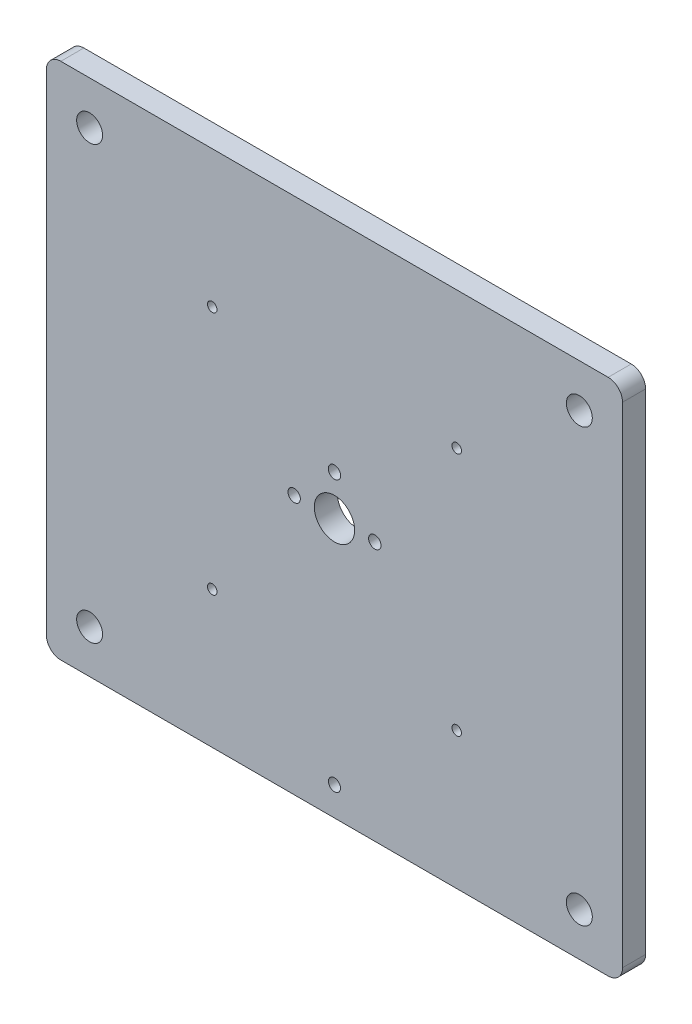
ISO-10303-21;
HEADER;
FILE_DESCRIPTION(('STEP AP214'),'2;1');
FILE_NAME('part.step','',(''),(''),'','','');
FILE_SCHEMA(('AUTOMOTIVE_DESIGN { 1 0 10303 214 1 1 1 1 }'));
ENDSEC;
DATA;
#1=APPLICATION_CONTEXT('core data for automotive mechanical design processes');
#2=APPLICATION_PROTOCOL_DEFINITION('international standard','automotive_design',2000,#1);
#3=PRODUCT_CONTEXT('',#1,'mechanical');
#4=PRODUCT('Part','Part','',(#3));
#5=PRODUCT_RELATED_PRODUCT_CATEGORY('part','',(#4));
#6=PRODUCT_DEFINITION_FORMATION('','',#4);
#7=PRODUCT_DEFINITION_CONTEXT('part definition',#1,'design');
#8=PRODUCT_DEFINITION('design','',#6,#7);
#9=PRODUCT_DEFINITION_SHAPE('','',#8);
#10=(LENGTH_UNIT() NAMED_UNIT(*) SI_UNIT(.MILLI.,.METRE.));
#11=(NAMED_UNIT(*) PLANE_ANGLE_UNIT() SI_UNIT($,.RADIAN.));
#12=(NAMED_UNIT(*) SI_UNIT($,.STERADIAN.) SOLID_ANGLE_UNIT());
#13=UNCERTAINTY_MEASURE_WITH_UNIT(LENGTH_MEASURE(1.E-05),#10,'distance_accuracy_value','');
#14=(GEOMETRIC_REPRESENTATION_CONTEXT(3) GLOBAL_UNCERTAINTY_ASSIGNED_CONTEXT((#13)) GLOBAL_UNIT_ASSIGNED_CONTEXT((#10,
#11,#12)) REPRESENTATION_CONTEXT('',''));
#15=CARTESIAN_POINT('',(0.,0.,0.));
#16=DIRECTION('',(0.,0.,1.));
#17=DIRECTION('',(1.,0.,0.));
#18=AXIS2_PLACEMENT_3D('',#15,#16,#17);
#19=CARTESIAN_POINT('',(14.,0.,0.));
#20=DIRECTION('',(0.,0.,-1.));
#21=DIRECTION('',(-1.,0.,0.));
#22=AXIS2_PLACEMENT_3D('',#19,#20,#21);
#23=CYLINDRICAL_SURFACE('',#22,3.75);
#24=CARTESIAN_POINT('',(14.,0.,0.));
#25=DIRECTION('',(0.,0.,-1.));
#26=DIRECTION('',(-1.,0.,0.));
#27=AXIS2_PLACEMENT_3D('',#24,#25,#26);
#28=CIRCLE('',#27,3.75);
#29=CARTESIAN_POINT('',(10.25,0.,0.));
#30=VERTEX_POINT('',#29);
#31=EDGE_CURVE('E217',#30,#30,#28,.F.);
#32=ORIENTED_EDGE('',*,*,#31,.F.);
#33=EDGE_LOOP('',(#32));
#34=FACE_BOUND('',#33,.T.);
#35=CARTESIAN_POINT('',(14.,0.,4.));
#36=DIRECTION('',(0.,0.,-1.));
#37=DIRECTION('',(-1.,0.,0.));
#38=AXIS2_PLACEMENT_3D('',#35,#36,#37);
#39=CIRCLE('',#38,3.75);
#40=CARTESIAN_POINT('',(10.25,0.,4.));
#41=VERTEX_POINT('',#40);
#42=EDGE_CURVE('E19',#41,#41,#39,.F.);
#43=ORIENTED_EDGE('',*,*,#42,.T.);
#44=EDGE_LOOP('',(#43));
#45=FACE_BOUND('',#44,.T.);
#46=ADVANCED_FACE('F16',(#34,#45),#23,.F.);
#47=CARTESIAN_POINT('',(-14.,0.,0.));
#48=DIRECTION('',(0.,0.,-1.));
#49=DIRECTION('',(-1.,0.,0.));
#50=AXIS2_PLACEMENT_3D('',#47,#48,#49);
#51=CYLINDRICAL_SURFACE('',#50,3.75);
#52=CARTESIAN_POINT('',(-14.,0.,0.));
#53=DIRECTION('',(0.,0.,-1.));
#54=DIRECTION('',(-1.,0.,0.));
#55=AXIS2_PLACEMENT_3D('',#52,#53,#54);
#56=CIRCLE('',#55,3.75);
#57=CARTESIAN_POINT('',(-17.75,0.,0.));
#58=VERTEX_POINT('',#57);
#59=EDGE_CURVE('E214',#58,#58,#56,.F.);
#60=ORIENTED_EDGE('',*,*,#59,.F.);
#61=EDGE_LOOP('',(#60));
#62=FACE_BOUND('',#61,.T.);
#63=CARTESIAN_POINT('',(-14.,0.,4.));
#64=DIRECTION('',(0.,0.,-1.));
#65=DIRECTION('',(-1.,0.,0.));
#66=AXIS2_PLACEMENT_3D('',#63,#64,#65);
#67=CIRCLE('',#66,3.75);
#68=CARTESIAN_POINT('',(-17.75,0.,4.));
#69=VERTEX_POINT('',#68);
#70=EDGE_CURVE('E222',#69,#69,#67,.F.);
#71=ORIENTED_EDGE('',*,*,#70,.T.);
#72=EDGE_LOOP('',(#71));
#73=FACE_BOUND('',#72,.T.);
#74=ADVANCED_FACE('F336',(#62,#73),#51,.F.);
#75=CARTESIAN_POINT('',(0.,14.,0.));
#76=DIRECTION('',(0.,0.,-1.));
#77=DIRECTION('',(-1.,0.,0.));
#78=AXIS2_PLACEMENT_3D('',#75,#76,#77);
#79=CYLINDRICAL_SURFACE('',#78,3.75);
#80=CARTESIAN_POINT('',(0.,14.,0.));
#81=DIRECTION('',(0.,0.,-1.));
#82=DIRECTION('',(-1.,0.,0.));
#83=AXIS2_PLACEMENT_3D('',#80,#81,#82);
#84=CIRCLE('',#83,3.75);
#85=CARTESIAN_POINT('',(-3.75,14.,0.));
#86=VERTEX_POINT('',#85);
#87=EDGE_CURVE('E211',#86,#86,#84,.F.);
#88=ORIENTED_EDGE('',*,*,#87,.F.);
#89=EDGE_LOOP('',(#88));
#90=FACE_BOUND('',#89,.T.);
#91=CARTESIAN_POINT('',(0.,14.,4.));
#92=DIRECTION('',(0.,0.,-1.));
#93=DIRECTION('',(-1.,0.,0.));
#94=AXIS2_PLACEMENT_3D('',#91,#92,#93);
#95=CIRCLE('',#94,3.75);
#96=CARTESIAN_POINT('',(-3.75,14.,4.));
#97=VERTEX_POINT('',#96);
#98=EDGE_CURVE('E220',#97,#97,#95,.F.);
#99=ORIENTED_EDGE('',*,*,#98,.T.);
#100=EDGE_LOOP('',(#99));
#101=FACE_BOUND('',#100,.T.);
#102=ADVANCED_FACE('F234',(#90,#101),#79,.F.);
#103=CARTESIAN_POINT('',(16.15,0.,4.));
#104=DIRECTION('',(0.,0.,1.));
#105=DIRECTION('',(1.,0.,0.));
#106=AXIS2_PLACEMENT_3D('',#103,#104,#105);
#107=PLANE('',#106);
#108=ORIENTED_EDGE('',*,*,#42,.F.);
#109=EDGE_LOOP('',(#108));
#110=FACE_BOUND('',#109,.T.);
#111=CARTESIAN_POINT('',(14.,0.,4.));
#112=DIRECTION('',(0.,0.,-1.));
#113=DIRECTION('',(-1.,0.,0.));
#114=AXIS2_PLACEMENT_3D('',#111,#112,#113);
#115=CIRCLE('',#114,2.15);
#116=CARTESIAN_POINT('',(11.85,0.,4.));
#117=VERTEX_POINT('',#116);
#118=EDGE_CURVE('E193',#117,#117,#115,.F.);
#119=ORIENTED_EDGE('',*,*,#118,.T.);
#120=EDGE_LOOP('',(#119));
#121=FACE_BOUND('',#120,.T.);
#122=ADVANCED_FACE('F230',(#110,#121),#107,.F.);
#123=CARTESIAN_POINT('',(-11.85,0.,4.));
#124=DIRECTION('',(0.,0.,1.));
#125=DIRECTION('',(1.,0.,0.));
#126=AXIS2_PLACEMENT_3D('',#123,#124,#125);
#127=PLANE('',#126);
#128=ORIENTED_EDGE('',*,*,#70,.F.);
#129=EDGE_LOOP('',(#128));
#130=FACE_BOUND('',#129,.T.);
#131=CARTESIAN_POINT('',(-14.,0.,4.));
#132=DIRECTION('',(0.,0.,-1.));
#133=DIRECTION('',(-1.,0.,0.));
#134=AXIS2_PLACEMENT_3D('',#131,#132,#133);
#135=CIRCLE('',#134,2.15);
#136=CARTESIAN_POINT('',(-16.15,0.,4.));
#137=VERTEX_POINT('',#136);
#138=EDGE_CURVE('E190',#137,#137,#135,.F.);
#139=ORIENTED_EDGE('',*,*,#138,.T.);
#140=EDGE_LOOP('',(#139));
#141=FACE_BOUND('',#140,.T.);
#142=ADVANCED_FACE('F233',(#130,#141),#127,.F.);
#143=CARTESIAN_POINT('',(2.15,14.,4.));
#144=DIRECTION('',(0.,0.,1.));
#145=DIRECTION('',(1.,0.,0.));
#146=AXIS2_PLACEMENT_3D('',#143,#144,#145);
#147=PLANE('',#146);
#148=ORIENTED_EDGE('',*,*,#98,.F.);
#149=EDGE_LOOP('',(#148));
#150=FACE_BOUND('',#149,.T.);
#151=CARTESIAN_POINT('',(0.,14.,4.));
#152=DIRECTION('',(0.,0.,-1.));
#153=DIRECTION('',(-1.,0.,0.));
#154=AXIS2_PLACEMENT_3D('',#151,#152,#153);
#155=CIRCLE('',#154,2.15);
#156=CARTESIAN_POINT('',(-2.15,14.,4.));
#157=VERTEX_POINT('',#156);
#158=EDGE_CURVE('E99',#157,#157,#155,.F.);
#159=ORIENTED_EDGE('',*,*,#158,.T.);
#160=EDGE_LOOP('',(#159));
#161=FACE_BOUND('',#160,.T.);
#162=ADVANCED_FACE('F319',(#150,#161),#147,.F.);
#163=CARTESIAN_POINT('',(-95.,85.,0.));
#164=DIRECTION('',(0.,0.,-1.));
#165=DIRECTION('',(-1.,0.,0.));
#166=AXIS2_PLACEMENT_3D('',#163,#164,#165);
#167=PLANE('',#166);
#168=CARTESIAN_POINT('',(0.,0.,0.));
#169=DIRECTION('',(0.,0.,-1.));
#170=DIRECTION('',(-1.,0.,0.));
#171=AXIS2_PLACEMENT_3D('',#168,#169,#170);
#172=CIRCLE('',#171,7.);
#173=CARTESIAN_POINT('',(-7.,0.,0.));
#174=VERTEX_POINT('',#173);
#175=EDGE_CURVE('E167',#174,#174,#172,.F.);
#176=ORIENTED_EDGE('',*,*,#175,.T.);
#177=EDGE_LOOP('',(#176));
#178=FACE_BOUND('',#177,.T.);
#179=CARTESIAN_POINT('',(85.,-75.,0.));
#180=DIRECTION('',(0.,0.,-1.));
#181=DIRECTION('',(-1.,0.,0.));
#182=AXIS2_PLACEMENT_3D('',#179,#180,#181);
#183=CIRCLE('',#182,4.49999999999999);
#184=CARTESIAN_POINT('',(80.5,-75.,0.));
#185=VERTEX_POINT('',#184);
#186=EDGE_CURVE('E173',#185,#185,#183,.F.);
#187=ORIENTED_EDGE('',*,*,#186,.T.);
#188=EDGE_LOOP('',(#187));
#189=FACE_BOUND('',#188,.T.);
#190=CARTESIAN_POINT('',(-85.,75.,0.));
#191=DIRECTION('',(0.,0.,-1.));
#192=DIRECTION('',(-1.,0.,0.));
#193=AXIS2_PLACEMENT_3D('',#190,#191,#192);
#194=CIRCLE('',#193,4.49999999999999);
#195=CARTESIAN_POINT('',(-89.5,75.,0.));
#196=VERTEX_POINT('',#195);
#197=EDGE_CURVE('E179',#196,#196,#194,.F.);
#198=ORIENTED_EDGE('',*,*,#197,.T.);
#199=EDGE_LOOP('',(#198));
#200=FACE_BOUND('',#199,.T.);
#201=CARTESIAN_POINT('',(-95.,-85.,0.));
#202=DIRECTION('',(0.,0.,-1.));
#203=DIRECTION('',(-1.,0.,0.));
#204=AXIS2_PLACEMENT_3D('',#201,#202,#203);
#205=CIRCLE('',#204,5.00000000000002);
#206=CARTESIAN_POINT('',(-100.,-85.,0.));
#207=VERTEX_POINT('',#206);
#208=CARTESIAN_POINT('',(-95.,-90.,0.));
#209=VERTEX_POINT('',#208);
#210=EDGE_CURVE('E115',#207,#209,#205,.F.);
#211=ORIENTED_EDGE('',*,*,#210,.F.);
#212=DIRECTION('',(0.,1.,0.));
#213=VECTOR('',#212,1.);
#214=CARTESIAN_POINT('',(-100.,85.,0.));
#215=LINE('',#214,#213);
#216=CARTESIAN_POINT('',(-100.,85.,0.));
#217=VERTEX_POINT('',#216);
#218=EDGE_CURVE('E109',#207,#217,#215,.T.);
#219=ORIENTED_EDGE('',*,*,#218,.T.);
#220=CARTESIAN_POINT('',(-95.,85.,0.));
#221=DIRECTION('',(0.,0.,-1.));
#222=DIRECTION('',(-1.,0.,0.));
#223=AXIS2_PLACEMENT_3D('',#220,#221,#222);
#224=CIRCLE('',#223,5.);
#225=CARTESIAN_POINT('',(-95.,90.,0.));
#226=VERTEX_POINT('',#225);
#227=EDGE_CURVE('E95',#226,#217,#224,.F.);
#228=ORIENTED_EDGE('',*,*,#227,.F.);
#229=DIRECTION('',(1.,0.,0.));
#230=VECTOR('',#229,1.);
#231=CARTESIAN_POINT('',(-95.,90.,0.));
#232=LINE('',#231,#230);
#233=CARTESIAN_POINT('',(95.,90.,0.));
#234=VERTEX_POINT('',#233);
#235=EDGE_CURVE('E89',#226,#234,#232,.T.);
#236=ORIENTED_EDGE('',*,*,#235,.T.);
#237=CARTESIAN_POINT('',(95.,85.,0.));
#238=DIRECTION('',(0.,0.,-1.));
#239=DIRECTION('',(-1.,0.,0.));
#240=AXIS2_PLACEMENT_3D('',#237,#238,#239);
#241=CIRCLE('',#240,5.);
#242=CARTESIAN_POINT('',(100.,85.,0.));
#243=VERTEX_POINT('',#242);
#244=EDGE_CURVE('E79',#243,#234,#241,.F.);
#245=ORIENTED_EDGE('',*,*,#244,.F.);
#246=DIRECTION('',(0.,-1.,0.));
#247=VECTOR('',#246,1.);
#248=CARTESIAN_POINT('',(100.,85.,0.));
#249=LINE('',#248,#247);
#250=CARTESIAN_POINT('',(100.,-85.,0.));
#251=VERTEX_POINT('',#250);
#252=EDGE_CURVE('E105',#243,#251,#249,.T.);
#253=ORIENTED_EDGE('',*,*,#252,.T.);
#254=CARTESIAN_POINT('',(95.,-85.,0.));
#255=DIRECTION('',(0.,0.,-1.));
#256=DIRECTION('',(-1.,0.,0.));
#257=AXIS2_PLACEMENT_3D('',#254,#255,#256);
#258=CIRCLE('',#257,5.);
#259=CARTESIAN_POINT('',(95.,-90.,0.));
#260=VERTEX_POINT('',#259);
#261=EDGE_CURVE('E117',#260,#251,#258,.F.);
#262=ORIENTED_EDGE('',*,*,#261,.F.);
#263=DIRECTION('',(1.,0.,0.));
#264=VECTOR('',#263,1.);
#265=CARTESIAN_POINT('',(-95.,-90.,0.));
#266=LINE('',#265,#264);
#267=EDGE_CURVE('E112',#260,#209,#266,.F.);
#268=ORIENTED_EDGE('',*,*,#267,.T.);
#269=EDGE_LOOP('',(#211,#219,#228,#236,#245,#253,#262,#268));
#270=FACE_BOUND('',#269,.T.);
#271=CARTESIAN_POINT('',(-85.,-75.,0.));
#272=DIRECTION('',(0.,0.,-1.));
#273=DIRECTION('',(-1.,0.,0.));
#274=AXIS2_PLACEMENT_3D('',#271,#272,#273);
#275=CIRCLE('',#274,4.5);
#276=CARTESIAN_POINT('',(-89.5,-75.,0.));
#277=VERTEX_POINT('',#276);
#278=EDGE_CURVE('E176',#277,#277,#275,.F.);
#279=ORIENTED_EDGE('',*,*,#278,.T.);
#280=EDGE_LOOP('',(#279));
#281=FACE_BOUND('',#280,.T.);
#282=CARTESIAN_POINT('',(85.,75.,0.));
#283=DIRECTION('',(0.,0.,-1.));
#284=DIRECTION('',(-1.,0.,0.));
#285=AXIS2_PLACEMENT_3D('',#282,#283,#284);
#286=CIRCLE('',#285,4.5);
#287=CARTESIAN_POINT('',(80.5,75.,0.));
#288=VERTEX_POINT('',#287);
#289=EDGE_CURVE('E170',#288,#288,#286,.F.);
#290=ORIENTED_EDGE('',*,*,#289,.T.);
#291=EDGE_LOOP('',(#290));
#292=FACE_BOUND('',#291,.T.);
#293=ORIENTED_EDGE('',*,*,#87,.T.);
#294=EDGE_LOOP('',(#293));
#295=FACE_BOUND('',#294,.T.);
#296=ORIENTED_EDGE('',*,*,#59,.T.);
#297=EDGE_LOOP('',(#296));
#298=FACE_BOUND('',#297,.T.);
#299=ORIENTED_EDGE('',*,*,#31,.T.);
#300=EDGE_LOOP('',(#299));
#301=FACE_BOUND('',#300,.T.);
#302=CARTESIAN_POINT('',(0.,-80.,0.));
#303=DIRECTION('',(0.,0.,1.));
#304=DIRECTION('',(1.,0.,0.));
#305=AXIS2_PLACEMENT_3D('',#302,#303,#304);
#306=CIRCLE('',#305,2.1);
#307=CARTESIAN_POINT('',(2.1,-80.,0.));
#308=VERTEX_POINT('',#307);
#309=EDGE_CURVE('E196',#308,#308,#306,.T.);
#310=ORIENTED_EDGE('',*,*,#309,.T.);
#311=EDGE_LOOP('',(#310));
#312=FACE_BOUND('',#311,.T.);
#313=CARTESIAN_POINT('',(-42.4264068711929,42.4264068711928,0.));
#314=DIRECTION('',(0.,0.,1.));
#315=DIRECTION('',(1.,0.,0.));
#316=AXIS2_PLACEMENT_3D('',#313,#314,#315);
#317=CIRCLE('',#316,1.65);
#318=CARTESIAN_POINT('',(-40.7764068711929,42.4264068711928,0.));
#319=VERTEX_POINT('',#318);
#320=EDGE_CURVE('E199',#319,#319,#317,.T.);
#321=ORIENTED_EDGE('',*,*,#320,.T.);
#322=EDGE_LOOP('',(#321));
#323=FACE_BOUND('',#322,.T.);
#324=CARTESIAN_POINT('',(42.4264068711929,42.4264068711928,0.));
#325=DIRECTION('',(0.,0.,1.));
#326=DIRECTION('',(1.,0.,0.));
#327=AXIS2_PLACEMENT_3D('',#324,#325,#326);
#328=CIRCLE('',#327,1.65);
#329=CARTESIAN_POINT('',(44.0764068711929,42.4264068711928,0.));
#330=VERTEX_POINT('',#329);
#331=EDGE_CURVE('E202',#330,#330,#328,.T.);
#332=ORIENTED_EDGE('',*,*,#331,.T.);
#333=EDGE_LOOP('',(#332));
#334=FACE_BOUND('',#333,.T.);
#335=CARTESIAN_POINT('',(42.4264068711929,-42.4264068711928,0.));
#336=DIRECTION('',(0.,0.,1.));
#337=DIRECTION('',(1.,0.,0.));
#338=AXIS2_PLACEMENT_3D('',#335,#336,#337);
#339=CIRCLE('',#338,1.65);
#340=CARTESIAN_POINT('',(44.0764068711929,-42.4264068711928,0.));
#341=VERTEX_POINT('',#340);
#342=EDGE_CURVE('E205',#341,#341,#339,.T.);
#343=ORIENTED_EDGE('',*,*,#342,.T.);
#344=EDGE_LOOP('',(#343));
#345=FACE_BOUND('',#344,.T.);
#346=CARTESIAN_POINT('',(-42.4264068711932,-42.4264068711925,0.));
#347=DIRECTION('',(0.,0.,1.));
#348=DIRECTION('',(1.,0.,0.));
#349=AXIS2_PLACEMENT_3D('',#346,#347,#348);
#350=CIRCLE('',#349,1.65);
#351=CARTESIAN_POINT('',(-40.7764068711932,-42.4264068711925,0.));
#352=VERTEX_POINT('',#351);
#353=EDGE_CURVE('E208',#352,#352,#350,.T.);
#354=ORIENTED_EDGE('',*,*,#353,.T.);
#355=EDGE_LOOP('',(#354));
#356=FACE_BOUND('',#355,.T.);
#357=ADVANCED_FACE('F92',(#178,#189,#200,#270,#281,#292,#295,#298,#301,#312,#323,#334,#345,
#356),#167,.T.);
#358=CARTESIAN_POINT('',(-42.4264068711932,-42.4264068711925,8.));
#359=DIRECTION('',(0.,0.,1.));
#360=DIRECTION('',(1.,0.,0.));
#361=AXIS2_PLACEMENT_3D('',#358,#359,#360);
#362=CYLINDRICAL_SURFACE('',#361,1.65);
#363=ORIENTED_EDGE('',*,*,#353,.F.);
#364=EDGE_LOOP('',(#363));
#365=FACE_BOUND('',#364,.T.);
#366=CARTESIAN_POINT('',(-42.4264068711932,-42.4264068711925,8.));
#367=DIRECTION('',(0.,0.,1.));
#368=DIRECTION('',(1.,0.,0.));
#369=AXIS2_PLACEMENT_3D('',#366,#367,#368);
#370=CIRCLE('',#369,1.65);
#371=CARTESIAN_POINT('',(-40.7764068711932,-42.4264068711925,8.));
#372=VERTEX_POINT('',#371);
#373=EDGE_CURVE('E164',#372,#372,#370,.T.);
#374=ORIENTED_EDGE('',*,*,#373,.T.);
#375=EDGE_LOOP('',(#374));
#376=FACE_BOUND('',#375,.T.);
#377=ADVANCED_FACE('F327',(#365,#376),#362,.F.);
#378=CARTESIAN_POINT('',(42.4264068711929,-42.4264068711928,8.));
#379=DIRECTION('',(0.,0.,1.));
#380=DIRECTION('',(1.,0.,0.));
#381=AXIS2_PLACEMENT_3D('',#378,#379,#380);
#382=CYLINDRICAL_SURFACE('',#381,1.65);
#383=ORIENTED_EDGE('',*,*,#342,.F.);
#384=EDGE_LOOP('',(#383));
#385=FACE_BOUND('',#384,.T.);
#386=CARTESIAN_POINT('',(42.4264068711929,-42.4264068711928,8.));
#387=DIRECTION('',(0.,0.,1.));
#388=DIRECTION('',(1.,0.,0.));
#389=AXIS2_PLACEMENT_3D('',#386,#387,#388);
#390=CIRCLE('',#389,1.65);
#391=CARTESIAN_POINT('',(44.0764068711929,-42.4264068711928,8.));
#392=VERTEX_POINT('',#391);
#393=EDGE_CURVE('E161',#392,#392,#390,.T.);
#394=ORIENTED_EDGE('',*,*,#393,.T.);
#395=EDGE_LOOP('',(#394));
#396=FACE_BOUND('',#395,.T.);
#397=ADVANCED_FACE('F362',(#385,#396),#382,.F.);
#398=CARTESIAN_POINT('',(42.4264068711929,42.4264068711928,8.));
#399=DIRECTION('',(0.,0.,1.));
#400=DIRECTION('',(1.,0.,0.));
#401=AXIS2_PLACEMENT_3D('',#398,#399,#400);
#402=CYLINDRICAL_SURFACE('',#401,1.65);
#403=ORIENTED_EDGE('',*,*,#331,.F.);
#404=EDGE_LOOP('',(#403));
#405=FACE_BOUND('',#404,.T.);
#406=CARTESIAN_POINT('',(42.4264068711929,42.4264068711928,8.));
#407=DIRECTION('',(0.,0.,1.));
#408=DIRECTION('',(1.,0.,0.));
#409=AXIS2_PLACEMENT_3D('',#406,#407,#408);
#410=CIRCLE('',#409,1.65);
#411=CARTESIAN_POINT('',(44.0764068711929,42.4264068711928,8.));
#412=VERTEX_POINT('',#411);
#413=EDGE_CURVE('E158',#412,#412,#410,.T.);
#414=ORIENTED_EDGE('',*,*,#413,.T.);
#415=EDGE_LOOP('',(#414));
#416=FACE_BOUND('',#415,.T.);
#417=ADVANCED_FACE('F368',(#405,#416),#402,.F.);
#418=CARTESIAN_POINT('',(-42.4264068711929,42.4264068711928,8.));
#419=DIRECTION('',(0.,0.,1.));
#420=DIRECTION('',(1.,0.,0.));
#421=AXIS2_PLACEMENT_3D('',#418,#419,#420);
#422=CYLINDRICAL_SURFACE('',#421,1.65);
#423=ORIENTED_EDGE('',*,*,#320,.F.);
#424=EDGE_LOOP('',(#423));
#425=FACE_BOUND('',#424,.T.);
#426=CARTESIAN_POINT('',(-42.4264068711929,42.4264068711928,8.));
#427=DIRECTION('',(0.,0.,1.));
#428=DIRECTION('',(1.,0.,0.));
#429=AXIS2_PLACEMENT_3D('',#426,#427,#428);
#430=CIRCLE('',#429,1.65);
#431=CARTESIAN_POINT('',(-40.7764068711929,42.4264068711928,8.));
#432=VERTEX_POINT('',#431);
#433=EDGE_CURVE('E155',#432,#432,#430,.T.);
#434=ORIENTED_EDGE('',*,*,#433,.T.);
#435=EDGE_LOOP('',(#434));
#436=FACE_BOUND('',#435,.T.);
#437=ADVANCED_FACE('F252',(#425,#436),#422,.F.);
#438=CARTESIAN_POINT('',(0.,-80.,8.));
#439=DIRECTION('',(0.,0.,1.));
#440=DIRECTION('',(1.,0.,0.));
#441=AXIS2_PLACEMENT_3D('',#438,#439,#440);
#442=CYLINDRICAL_SURFACE('',#441,2.1);
#443=ORIENTED_EDGE('',*,*,#309,.F.);
#444=EDGE_LOOP('',(#443));
#445=FACE_BOUND('',#444,.T.);
#446=CARTESIAN_POINT('',(0.,-80.,8.));
#447=DIRECTION('',(0.,0.,1.));
#448=DIRECTION('',(1.,0.,0.));
#449=AXIS2_PLACEMENT_3D('',#446,#447,#448);
#450=CIRCLE('',#449,2.1);
#451=CARTESIAN_POINT('',(2.1,-80.,8.));
#452=VERTEX_POINT('',#451);
#453=EDGE_CURVE('E152',#452,#452,#450,.T.);
#454=ORIENTED_EDGE('',*,*,#453,.T.);
#455=EDGE_LOOP('',(#454));
#456=FACE_BOUND('',#455,.T.);
#457=ADVANCED_FACE('F241',(#445,#456),#442,.F.);
#458=CARTESIAN_POINT('',(14.,0.,0.));
#459=DIRECTION('',(0.,0.,-1.));
#460=DIRECTION('',(-1.,0.,0.));
#461=AXIS2_PLACEMENT_3D('',#458,#459,#460);
#462=CYLINDRICAL_SURFACE('',#461,2.15);
#463=CARTESIAN_POINT('',(14.,0.,8.));
#464=DIRECTION('',(0.,0.,-1.));
#465=DIRECTION('',(-1.,0.,0.));
#466=AXIS2_PLACEMENT_3D('',#463,#464,#465);
#467=CIRCLE('',#466,2.15);
#468=CARTESIAN_POINT('',(11.85,0.,8.));
#469=VERTEX_POINT('',#468);
#470=EDGE_CURVE('E149',#469,#469,#467,.F.);
#471=ORIENTED_EDGE('',*,*,#470,.T.);
#472=EDGE_LOOP('',(#471));
#473=FACE_BOUND('',#472,.T.);
#474=ORIENTED_EDGE('',*,*,#118,.F.);
#475=EDGE_LOOP('',(#474));
#476=FACE_BOUND('',#475,.T.);
#477=ADVANCED_FACE('F238',(#473,#476),#462,.F.);
#478=CARTESIAN_POINT('',(-14.,0.,0.));
#479=DIRECTION('',(0.,0.,-1.));
#480=DIRECTION('',(-1.,0.,0.));
#481=AXIS2_PLACEMENT_3D('',#478,#479,#480);
#482=CYLINDRICAL_SURFACE('',#481,2.15);
#483=CARTESIAN_POINT('',(-14.,0.,8.));
#484=DIRECTION('',(0.,0.,-1.));
#485=DIRECTION('',(-1.,0.,0.));
#486=AXIS2_PLACEMENT_3D('',#483,#484,#485);
#487=CIRCLE('',#486,2.15);
#488=CARTESIAN_POINT('',(-16.15,0.,8.));
#489=VERTEX_POINT('',#488);
#490=EDGE_CURVE('E146',#489,#489,#487,.F.);
#491=ORIENTED_EDGE('',*,*,#490,.T.);
#492=EDGE_LOOP('',(#491));
#493=FACE_BOUND('',#492,.T.);
#494=ORIENTED_EDGE('',*,*,#138,.F.);
#495=EDGE_LOOP('',(#494));
#496=FACE_BOUND('',#495,.T.);
#497=ADVANCED_FACE('F240',(#493,#496),#482,.F.);
#498=CARTESIAN_POINT('',(0.,14.,0.));
#499=DIRECTION('',(0.,0.,-1.));
#500=DIRECTION('',(-1.,0.,0.));
#501=AXIS2_PLACEMENT_3D('',#498,#499,#500);
#502=CYLINDRICAL_SURFACE('',#501,2.15);
#503=CARTESIAN_POINT('',(0.,14.,8.));
#504=DIRECTION('',(0.,0.,-1.));
#505=DIRECTION('',(-1.,0.,0.));
#506=AXIS2_PLACEMENT_3D('',#503,#504,#505);
#507=CIRCLE('',#506,2.15);
#508=CARTESIAN_POINT('',(-2.15,14.,8.));
#509=VERTEX_POINT('',#508);
#510=EDGE_CURVE('E143',#509,#509,#507,.F.);
#511=ORIENTED_EDGE('',*,*,#510,.T.);
#512=EDGE_LOOP('',(#511));
#513=FACE_BOUND('',#512,.T.);
#514=ORIENTED_EDGE('',*,*,#158,.F.);
#515=EDGE_LOOP('',(#514));
#516=FACE_BOUND('',#515,.T.);
#517=ADVANCED_FACE('F249',(#513,#516),#502,.F.);
#518=CARTESIAN_POINT('',(-95.,90.,8.));
#519=DIRECTION('',(0.,-1.,0.));
#520=DIRECTION('',(0.,0.,-1.));
#521=AXIS2_PLACEMENT_3D('',#518,#519,#520);
#522=PLANE('',#521);
#523=DIRECTION('',(0.,0.,-1.));
#524=VECTOR('',#523,1.);
#525=CARTESIAN_POINT('',(-95.,90.,8.));
#526=LINE('',#525,#524);
#527=CARTESIAN_POINT('',(-95.,90.,8.));
#528=VERTEX_POINT('',#527);
#529=EDGE_CURVE('E182',#528,#226,#526,.T.);
#530=ORIENTED_EDGE('',*,*,#529,.F.);
#531=DIRECTION('',(-1.,0.,0.));
#532=VECTOR('',#531,1.);
#533=CARTESIAN_POINT('',(-95.,90.,8.));
#534=LINE('',#533,#532);
#535=CARTESIAN_POINT('',(95.,90.,8.));
#536=VERTEX_POINT('',#535);
#537=EDGE_CURVE('E103',#528,#536,#534,.F.);
#538=ORIENTED_EDGE('',*,*,#537,.T.);
#539=DIRECTION('',(0.,0.,-1.));
#540=VECTOR('',#539,1.);
#541=CARTESIAN_POINT('',(95.,90.,8.));
#542=LINE('',#541,#540);
#543=EDGE_CURVE('E86',#234,#536,#542,.F.);
#544=ORIENTED_EDGE('',*,*,#543,.F.);
#545=ORIENTED_EDGE('',*,*,#235,.F.);
#546=EDGE_LOOP('',(#530,#538,#544,#545));
#547=FACE_BOUND('',#546,.T.);
#548=ADVANCED_FACE('F102',(#547),#522,.F.);
#549=CARTESIAN_POINT('',(95.,85.,8.));
#550=DIRECTION('',(0.,0.,-1.));
#551=DIRECTION('',(-1.,0.,0.));
#552=AXIS2_PLACEMENT_3D('',#549,#550,#551);
#553=CYLINDRICAL_SURFACE('',#552,5.);
#554=CARTESIAN_POINT('',(95.,85.,8.));
#555=DIRECTION('',(0.,0.,-1.));
#556=DIRECTION('',(-1.,0.,0.));
#557=AXIS2_PLACEMENT_3D('',#554,#555,#556);
#558=CIRCLE('',#557,5.);
#559=CARTESIAN_POINT('',(100.,85.,8.));
#560=VERTEX_POINT('',#559);
#561=EDGE_CURVE('E141',#536,#560,#558,.T.);
#562=ORIENTED_EDGE('',*,*,#561,.T.);
#563=DIRECTION('',(0.,0.,1.));
#564=VECTOR('',#563,1.);
#565=CARTESIAN_POINT('',(100.,85.,8.));
#566=LINE('',#565,#564);
#567=EDGE_CURVE('E88',#560,#243,#566,.F.);
#568=ORIENTED_EDGE('',*,*,#567,.T.);
#569=ORIENTED_EDGE('',*,*,#244,.T.);
#570=ORIENTED_EDGE('',*,*,#543,.T.);
#571=EDGE_LOOP('',(#562,#568,#569,#570));
#572=FACE_BOUND('',#571,.T.);
#573=ADVANCED_FACE('F84',(#572),#553,.T.);
#574=CARTESIAN_POINT('',(100.,85.,8.));
#575=DIRECTION('',(-1.,0.,0.));
#576=DIRECTION('',(0.,-1.,0.));
#577=AXIS2_PLACEMENT_3D('',#574,#575,#576);
#578=PLANE('',#577);
#579=ORIENTED_EDGE('',*,*,#567,.F.);
#580=DIRECTION('',(0.,1.,0.));
#581=VECTOR('',#580,1.);
#582=CARTESIAN_POINT('',(100.,85.,8.));
#583=LINE('',#582,#581);
#584=CARTESIAN_POINT('',(100.,-85.,8.));
#585=VERTEX_POINT('',#584);
#586=EDGE_CURVE('E140',#560,#585,#583,.F.);
#587=ORIENTED_EDGE('',*,*,#586,.T.);
#588=DIRECTION('',(0.,0.,-1.));
#589=VECTOR('',#588,1.);
#590=CARTESIAN_POINT('',(100.,-85.,8.));
#591=LINE('',#590,#589);
#592=EDGE_CURVE('E186',#251,#585,#591,.F.);
#593=ORIENTED_EDGE('',*,*,#592,.F.);
#594=ORIENTED_EDGE('',*,*,#252,.F.);
#595=EDGE_LOOP('',(#579,#587,#593,#594));
#596=FACE_BOUND('',#595,.T.);
#597=ADVANCED_FACE('F302',(#596),#578,.F.);
#598=CARTESIAN_POINT('',(95.,-85.,8.));
#599=DIRECTION('',(0.,0.,-1.));
#600=DIRECTION('',(-1.,0.,0.));
#601=AXIS2_PLACEMENT_3D('',#598,#599,#600);
#602=CYLINDRICAL_SURFACE('',#601,5.);
#603=CARTESIAN_POINT('',(95.,-85.,8.));
#604=DIRECTION('',(0.,0.,-1.));
#605=DIRECTION('',(-1.,0.,0.));
#606=AXIS2_PLACEMENT_3D('',#603,#604,#605);
#607=CIRCLE('',#606,5.);
#608=CARTESIAN_POINT('',(95.,-90.,8.));
#609=VERTEX_POINT('',#608);
#610=EDGE_CURVE('E137',#585,#609,#607,.T.);
#611=ORIENTED_EDGE('',*,*,#610,.T.);
#612=DIRECTION('',(0.,0.,1.));
#613=VECTOR('',#612,1.);
#614=CARTESIAN_POINT('',(95.,-90.,8.));
#615=LINE('',#614,#613);
#616=EDGE_CURVE('E116',#609,#260,#615,.F.);
#617=ORIENTED_EDGE('',*,*,#616,.T.);
#618=ORIENTED_EDGE('',*,*,#261,.T.);
#619=ORIENTED_EDGE('',*,*,#592,.T.);
#620=EDGE_LOOP('',(#611,#617,#618,#619));
#621=FACE_BOUND('',#620,.T.);
#622=ADVANCED_FACE('F298',(#621),#602,.T.);
#623=CARTESIAN_POINT('',(-95.,-90.,8.));
#624=DIRECTION('',(0.,1.,0.));
#625=DIRECTION('',(0.,0.,1.));
#626=AXIS2_PLACEMENT_3D('',#623,#624,#625);
#627=PLANE('',#626);
#628=ORIENTED_EDGE('',*,*,#616,.F.);
#629=DIRECTION('',(-1.,0.,0.));
#630=VECTOR('',#629,1.);
#631=CARTESIAN_POINT('',(-95.,-90.,8.));
#632=LINE('',#631,#630);
#633=CARTESIAN_POINT('',(-95.,-90.,8.));
#634=VERTEX_POINT('',#633);
#635=EDGE_CURVE('E136',#609,#634,#632,.T.);
#636=ORIENTED_EDGE('',*,*,#635,.T.);
#637=DIRECTION('',(0.,0.,-1.));
#638=VECTOR('',#637,1.);
#639=CARTESIAN_POINT('',(-95.,-90.,8.));
#640=LINE('',#639,#638);
#641=EDGE_CURVE('E185',#209,#634,#640,.F.);
#642=ORIENTED_EDGE('',*,*,#641,.F.);
#643=ORIENTED_EDGE('',*,*,#267,.F.);
#644=EDGE_LOOP('',(#628,#636,#642,#643));
#645=FACE_BOUND('',#644,.T.);
#646=ADVANCED_FACE('F294',(#645),#627,.F.);
#647=CARTESIAN_POINT('',(-95.,-85.,8.));
#648=DIRECTION('',(0.,0.,-1.));
#649=DIRECTION('',(-1.,0.,0.));
#650=AXIS2_PLACEMENT_3D('',#647,#648,#649);
#651=CYLINDRICAL_SURFACE('',#650,5.00000000000002);
#652=CARTESIAN_POINT('',(-95.,-85.,8.));
#653=DIRECTION('',(0.,0.,-1.));
#654=DIRECTION('',(-1.,0.,0.));
#655=AXIS2_PLACEMENT_3D('',#652,#653,#654);
#656=CIRCLE('',#655,5.00000000000002);
#657=CARTESIAN_POINT('',(-100.,-85.,8.));
#658=VERTEX_POINT('',#657);
#659=EDGE_CURVE('E133',#634,#658,#656,.T.);
#660=ORIENTED_EDGE('',*,*,#659,.T.);
#661=DIRECTION('',(0.,0.,1.));
#662=VECTOR('',#661,1.);
#663=CARTESIAN_POINT('',(-100.,-85.,8.));
#664=LINE('',#663,#662);
#665=EDGE_CURVE('E111',#658,#207,#664,.F.);
#666=ORIENTED_EDGE('',*,*,#665,.T.);
#667=ORIENTED_EDGE('',*,*,#210,.T.);
#668=ORIENTED_EDGE('',*,*,#641,.T.);
#669=EDGE_LOOP('',(#660,#666,#667,#668));
#670=FACE_BOUND('',#669,.T.);
#671=ADVANCED_FACE('F290',(#670),#651,.T.);
#672=CARTESIAN_POINT('',(-100.,85.,8.));
#673=DIRECTION('',(1.,0.,0.));
#674=DIRECTION('',(0.,1.,0.));
#675=AXIS2_PLACEMENT_3D('',#672,#673,#674);
#676=PLANE('',#675);
#677=ORIENTED_EDGE('',*,*,#665,.F.);
#678=DIRECTION('',(0.,1.,0.));
#679=VECTOR('',#678,1.);
#680=CARTESIAN_POINT('',(-100.,85.,8.));
#681=LINE('',#680,#679);
#682=CARTESIAN_POINT('',(-100.,85.,8.));
#683=VERTEX_POINT('',#682);
#684=EDGE_CURVE('E132',#658,#683,#681,.T.);
#685=ORIENTED_EDGE('',*,*,#684,.T.);
#686=DIRECTION('',(0.,0.,-1.));
#687=VECTOR('',#686,1.);
#688=CARTESIAN_POINT('',(-100.,85.,8.));
#689=LINE('',#688,#687);
#690=EDGE_CURVE('E34',#217,#683,#689,.F.);
#691=ORIENTED_EDGE('',*,*,#690,.F.);
#692=ORIENTED_EDGE('',*,*,#218,.F.);
#693=EDGE_LOOP('',(#677,#685,#691,#692));
#694=FACE_BOUND('',#693,.T.);
#695=ADVANCED_FACE('F287',(#694),#676,.F.);
#696=CARTESIAN_POINT('',(-95.,85.,8.));
#697=DIRECTION('',(0.,0.,-1.));
#698=DIRECTION('',(-1.,0.,0.));
#699=AXIS2_PLACEMENT_3D('',#696,#697,#698);
#700=CYLINDRICAL_SURFACE('',#699,5.);
#701=CARTESIAN_POINT('',(-95.,85.,8.));
#702=DIRECTION('',(0.,0.,-1.));
#703=DIRECTION('',(-1.,0.,0.));
#704=AXIS2_PLACEMENT_3D('',#701,#702,#703);
#705=CIRCLE('',#704,5.);
#706=EDGE_CURVE('E130',#683,#528,#705,.T.);
#707=ORIENTED_EDGE('',*,*,#706,.T.);
#708=ORIENTED_EDGE('',*,*,#529,.T.);
#709=ORIENTED_EDGE('',*,*,#227,.T.);
#710=ORIENTED_EDGE('',*,*,#690,.T.);
#711=EDGE_LOOP('',(#707,#708,#709,#710));
#712=FACE_BOUND('',#711,.T.);
#713=ADVANCED_FACE('F283',(#712),#700,.T.);
#714=CARTESIAN_POINT('',(-85.,75.,8.));
#715=DIRECTION('',(0.,0.,-1.));
#716=DIRECTION('',(-1.,0.,0.));
#717=AXIS2_PLACEMENT_3D('',#714,#715,#716);
#718=CYLINDRICAL_SURFACE('',#717,4.49999999999999);
#719=ORIENTED_EDGE('',*,*,#197,.F.);
#720=EDGE_LOOP('',(#719));
#721=FACE_BOUND('',#720,.T.);
#722=CARTESIAN_POINT('',(-85.,75.,8.));
#723=DIRECTION('',(0.,0.,-1.));
#724=DIRECTION('',(-1.,0.,0.));
#725=AXIS2_PLACEMENT_3D('',#722,#723,#724);
#726=CIRCLE('',#725,4.49999999999999);
#727=CARTESIAN_POINT('',(-89.5,75.,8.));
#728=VERTEX_POINT('',#727);
#729=EDGE_CURVE('E127',#728,#728,#726,.F.);
#730=ORIENTED_EDGE('',*,*,#729,.T.);
#731=EDGE_LOOP('',(#730));
#732=FACE_BOUND('',#731,.T.);
#733=ADVANCED_FACE('F279',(#721,#732),#718,.F.);
#734=CARTESIAN_POINT('',(-85.,-75.,8.));
#735=DIRECTION('',(0.,0.,-1.));
#736=DIRECTION('',(-1.,0.,0.));
#737=AXIS2_PLACEMENT_3D('',#734,#735,#736);
#738=CYLINDRICAL_SURFACE('',#737,4.5);
#739=ORIENTED_EDGE('',*,*,#278,.F.);
#740=EDGE_LOOP('',(#739));
#741=FACE_BOUND('',#740,.T.);
#742=CARTESIAN_POINT('',(-85.,-75.,8.));
#743=DIRECTION('',(0.,0.,-1.));
#744=DIRECTION('',(-1.,0.,0.));
#745=AXIS2_PLACEMENT_3D('',#742,#743,#744);
#746=CIRCLE('',#745,4.5);
#747=CARTESIAN_POINT('',(-89.5,-75.,8.));
#748=VERTEX_POINT('',#747);
#749=EDGE_CURVE('E124',#748,#748,#746,.F.);
#750=ORIENTED_EDGE('',*,*,#749,.T.);
#751=EDGE_LOOP('',(#750));
#752=FACE_BOUND('',#751,.T.);
#753=ADVANCED_FACE('F275',(#741,#752),#738,.F.);
#754=CARTESIAN_POINT('',(85.,-75.,8.));
#755=DIRECTION('',(0.,0.,-1.));
#756=DIRECTION('',(-1.,0.,0.));
#757=AXIS2_PLACEMENT_3D('',#754,#755,#756);
#758=CYLINDRICAL_SURFACE('',#757,4.49999999999999);
#759=ORIENTED_EDGE('',*,*,#186,.F.);
#760=EDGE_LOOP('',(#759));
#761=FACE_BOUND('',#760,.T.);
#762=CARTESIAN_POINT('',(85.,-75.,8.));
#763=DIRECTION('',(0.,0.,-1.));
#764=DIRECTION('',(-1.,0.,0.));
#765=AXIS2_PLACEMENT_3D('',#762,#763,#764);
#766=CIRCLE('',#765,4.49999999999999);
#767=CARTESIAN_POINT('',(80.5,-75.,8.));
#768=VERTEX_POINT('',#767);
#769=EDGE_CURVE('E121',#768,#768,#766,.F.);
#770=ORIENTED_EDGE('',*,*,#769,.T.);
#771=EDGE_LOOP('',(#770));
#772=FACE_BOUND('',#771,.T.);
#773=ADVANCED_FACE('F271',(#761,#772),#758,.F.);
#774=CARTESIAN_POINT('',(85.,75.,8.));
#775=DIRECTION('',(0.,0.,-1.));
#776=DIRECTION('',(-1.,0.,0.));
#777=AXIS2_PLACEMENT_3D('',#774,#775,#776);
#778=CYLINDRICAL_SURFACE('',#777,4.5);
#779=ORIENTED_EDGE('',*,*,#289,.F.);
#780=EDGE_LOOP('',(#779));
#781=FACE_BOUND('',#780,.T.);
#782=CARTESIAN_POINT('',(85.,75.,8.));
#783=DIRECTION('',(0.,0.,-1.));
#784=DIRECTION('',(-1.,0.,0.));
#785=AXIS2_PLACEMENT_3D('',#782,#783,#784);
#786=CIRCLE('',#785,4.5);
#787=CARTESIAN_POINT('',(80.5,75.,8.));
#788=VERTEX_POINT('',#787);
#789=EDGE_CURVE('E25',#788,#788,#786,.F.);
#790=ORIENTED_EDGE('',*,*,#789,.T.);
#791=EDGE_LOOP('',(#790));
#792=FACE_BOUND('',#791,.T.);
#793=ADVANCED_FACE('F263',(#781,#792),#778,.F.);
#794=CARTESIAN_POINT('',(0.,0.,8.));
#795=DIRECTION('',(0.,0.,-1.));
#796=DIRECTION('',(-1.,0.,0.));
#797=AXIS2_PLACEMENT_3D('',#794,#795,#796);
#798=CYLINDRICAL_SURFACE('',#797,7.);
#799=ORIENTED_EDGE('',*,*,#175,.F.);
#800=EDGE_LOOP('',(#799));
#801=FACE_BOUND('',#800,.T.);
#802=CARTESIAN_POINT('',(0.,0.,8.));
#803=DIRECTION('',(0.,0.,-1.));
#804=DIRECTION('',(-1.,0.,0.));
#805=AXIS2_PLACEMENT_3D('',#802,#803,#804);
#806=CIRCLE('',#805,7.);
#807=CARTESIAN_POINT('',(-7.,0.,8.));
#808=VERTEX_POINT('',#807);
#809=EDGE_CURVE('E11',#808,#808,#806,.F.);
#810=ORIENTED_EDGE('',*,*,#809,.T.);
#811=EDGE_LOOP('',(#810));
#812=FACE_BOUND('',#811,.T.);
#813=ADVANCED_FACE('F257',(#801,#812),#798,.F.);
#814=CARTESIAN_POINT('',(-95.,85.,8.));
#815=DIRECTION('',(0.,0.,-1.));
#816=DIRECTION('',(-1.,0.,0.));
#817=AXIS2_PLACEMENT_3D('',#814,#815,#816);
#818=PLANE('',#817);
#819=ORIENTED_EDGE('',*,*,#809,.F.);
#820=EDGE_LOOP('',(#819));
#821=FACE_BOUND('',#820,.T.);
#822=ORIENTED_EDGE('',*,*,#789,.F.);
#823=EDGE_LOOP('',(#822));
#824=FACE_BOUND('',#823,.T.);
#825=ORIENTED_EDGE('',*,*,#769,.F.);
#826=EDGE_LOOP('',(#825));
#827=FACE_BOUND('',#826,.T.);
#828=ORIENTED_EDGE('',*,*,#749,.F.);
#829=EDGE_LOOP('',(#828));
#830=FACE_BOUND('',#829,.T.);
#831=ORIENTED_EDGE('',*,*,#729,.F.);
#832=EDGE_LOOP('',(#831));
#833=FACE_BOUND('',#832,.T.);
#834=ORIENTED_EDGE('',*,*,#684,.F.);
#835=ORIENTED_EDGE('',*,*,#659,.F.);
#836=ORIENTED_EDGE('',*,*,#635,.F.);
#837=ORIENTED_EDGE('',*,*,#610,.F.);
#838=ORIENTED_EDGE('',*,*,#586,.F.);
#839=ORIENTED_EDGE('',*,*,#561,.F.);
#840=ORIENTED_EDGE('',*,*,#537,.F.);
#841=ORIENTED_EDGE('',*,*,#706,.F.);
#842=EDGE_LOOP('',(#834,#835,#836,#837,#838,#839,#840,#841));
#843=FACE_BOUND('',#842,.T.);
#844=ORIENTED_EDGE('',*,*,#510,.F.);
#845=EDGE_LOOP('',(#844));
#846=FACE_BOUND('',#845,.T.);
#847=ORIENTED_EDGE('',*,*,#490,.F.);
#848=EDGE_LOOP('',(#847));
#849=FACE_BOUND('',#848,.T.);
#850=ORIENTED_EDGE('',*,*,#470,.F.);
#851=EDGE_LOOP('',(#850));
#852=FACE_BOUND('',#851,.T.);
#853=ORIENTED_EDGE('',*,*,#453,.F.);
#854=EDGE_LOOP('',(#853));
#855=FACE_BOUND('',#854,.T.);
#856=ORIENTED_EDGE('',*,*,#433,.F.);
#857=EDGE_LOOP('',(#856));
#858=FACE_BOUND('',#857,.T.);
#859=ORIENTED_EDGE('',*,*,#413,.F.);
#860=EDGE_LOOP('',(#859));
#861=FACE_BOUND('',#860,.T.);
#862=ORIENTED_EDGE('',*,*,#393,.F.);
#863=EDGE_LOOP('',(#862));
#864=FACE_BOUND('',#863,.T.);
#865=ORIENTED_EDGE('',*,*,#373,.F.);
#866=EDGE_LOOP('',(#865));
#867=FACE_BOUND('',#866,.T.);
#868=ADVANCED_FACE('F255',(#821,#824,#827,#830,#833,#843,#846,#849,#852,#855,#858,#861,#864,
#867),#818,.F.);
#869=CLOSED_SHELL('',(#46,#74,#102,#122,#142,#162,#357,#377,#397,#417,#437,#457,#477,#497,#517,
#548,#573,#597,#622,#646,#671,#695,#713,#733,#753,#773,#793,#813,#868));
#870=MANIFOLD_SOLID_BREP('B1',#869);
#871=ADVANCED_BREP_SHAPE_REPRESENTATION('',(#18,#870),#14);
#872=SHAPE_DEFINITION_REPRESENTATION(#9,#871);
ENDSEC;
END-ISO-10303-21;
